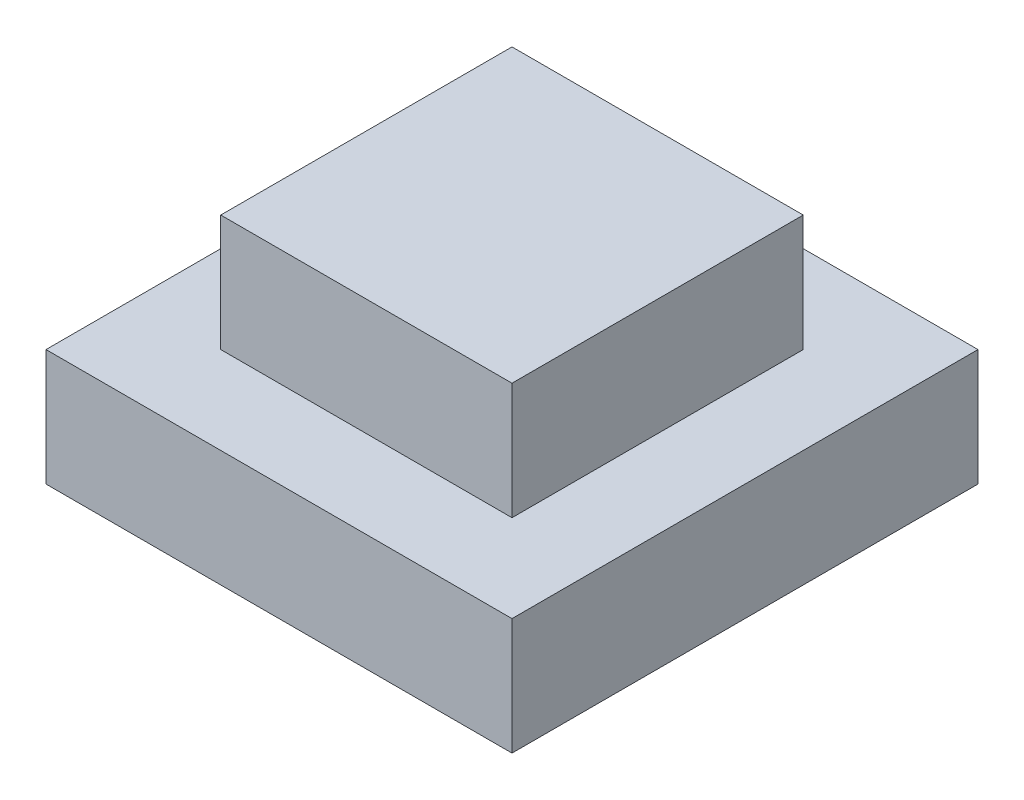
ISO-10303-21;
HEADER;
FILE_DESCRIPTION(('STEP AP214'),'2;1');
FILE_NAME('part.step','',(''),(''),'','','');
FILE_SCHEMA(('AUTOMOTIVE_DESIGN { 1 0 10303 214 1 1 1 1 }'));
ENDSEC;
DATA;
#1=APPLICATION_CONTEXT('core data for automotive mechanical design processes');
#2=APPLICATION_PROTOCOL_DEFINITION('international standard','automotive_design',2000,#1);
#3=PRODUCT_CONTEXT('',#1,'mechanical');
#4=PRODUCT('Part','Part','',(#3));
#5=PRODUCT_RELATED_PRODUCT_CATEGORY('part','',(#4));
#6=PRODUCT_DEFINITION_FORMATION('','',#4);
#7=PRODUCT_DEFINITION_CONTEXT('part definition',#1,'design');
#8=PRODUCT_DEFINITION('design','',#6,#7);
#9=PRODUCT_DEFINITION_SHAPE('','',#8);
#10=(LENGTH_UNIT() NAMED_UNIT(*) SI_UNIT(.MILLI.,.METRE.));
#11=(NAMED_UNIT(*) PLANE_ANGLE_UNIT() SI_UNIT($,.RADIAN.));
#12=(NAMED_UNIT(*) SI_UNIT($,.STERADIAN.) SOLID_ANGLE_UNIT());
#13=UNCERTAINTY_MEASURE_WITH_UNIT(LENGTH_MEASURE(1.E-05),#10,'distance_accuracy_value','');
#14=(GEOMETRIC_REPRESENTATION_CONTEXT(3) GLOBAL_UNCERTAINTY_ASSIGNED_CONTEXT((#13)) GLOBAL_UNIT_ASSIGNED_CONTEXT((#10,
#11,#12)) REPRESENTATION_CONTEXT('',''));
#15=CARTESIAN_POINT('',(0.,0.,0.));
#16=DIRECTION('',(0.,0.,1.));
#17=DIRECTION('',(1.,0.,0.));
#18=AXIS2_PLACEMENT_3D('',#15,#16,#17);
#19=CARTESIAN_POINT('',(4.,3.,-4.));
#20=DIRECTION('',(-1.,0.,0.));
#21=DIRECTION('',(0.,0.,1.));
#22=AXIS2_PLACEMENT_3D('',#19,#20,#21);
#23=PLANE('',#22);
#24=DIRECTION('',(0.,-1.,0.));
#25=VECTOR('',#24,1.);
#26=CARTESIAN_POINT('',(4.,3.,4.));
#27=LINE('',#26,#25);
#28=CARTESIAN_POINT('',(4.,3.,4.));
#29=VERTEX_POINT('',#28);
#30=CARTESIAN_POINT('',(4.,1.,4.));
#31=VERTEX_POINT('',#30);
#32=EDGE_CURVE('E155',#29,#31,#27,.T.);
#33=ORIENTED_EDGE('',*,*,#32,.T.);
#34=DIRECTION('',(0.,0.,-1.));
#35=VECTOR('',#34,1.);
#36=CARTESIAN_POINT('',(4.,1.,-4.));
#37=LINE('',#36,#35);
#38=CARTESIAN_POINT('',(4.,1.,-4.));
#39=VERTEX_POINT('',#38);
#40=EDGE_CURVE('E11',#31,#39,#37,.T.);
#41=ORIENTED_EDGE('',*,*,#40,.T.);
#42=DIRECTION('',(0.,-1.,0.));
#43=VECTOR('',#42,1.);
#44=CARTESIAN_POINT('',(4.,3.,-4.));
#45=LINE('',#44,#43);
#46=CARTESIAN_POINT('',(4.,3.,-4.));
#47=VERTEX_POINT('',#46);
#48=EDGE_CURVE('E164',#47,#39,#45,.T.);
#49=ORIENTED_EDGE('',*,*,#48,.F.);
#50=DIRECTION('',(0.,0.,-1.));
#51=VECTOR('',#50,1.);
#52=CARTESIAN_POINT('',(4.,3.,-4.));
#53=LINE('',#52,#51);
#54=EDGE_CURVE('E146',#29,#47,#53,.T.);
#55=ORIENTED_EDGE('',*,*,#54,.F.);
#56=EDGE_LOOP('',(#33,#41,#49,#55));
#57=FACE_BOUND('',#56,.T.);
#58=ADVANCED_FACE('F39',(#57),#23,.F.);
#59=CARTESIAN_POINT('',(-4.,3.,-4.));
#60=DIRECTION('',(0.,0.,1.));
#61=DIRECTION('',(1.,0.,0.));
#62=AXIS2_PLACEMENT_3D('',#59,#60,#61);
#63=PLANE('',#62);
#64=ORIENTED_EDGE('',*,*,#48,.T.);
#65=DIRECTION('',(-1.,0.,0.));
#66=VECTOR('',#65,1.);
#67=CARTESIAN_POINT('',(-4.,1.,-4.));
#68=LINE('',#67,#66);
#69=CARTESIAN_POINT('',(-4.,1.,-4.));
#70=VERTEX_POINT('',#69);
#71=EDGE_CURVE('E167',#39,#70,#68,.T.);
#72=ORIENTED_EDGE('',*,*,#71,.T.);
#73=DIRECTION('',(0.,-1.,0.));
#74=VECTOR('',#73,1.);
#75=CARTESIAN_POINT('',(-4.,3.,-4.));
#76=LINE('',#75,#74);
#77=CARTESIAN_POINT('',(-4.,3.,-4.));
#78=VERTEX_POINT('',#77);
#79=EDGE_CURVE('E161',#78,#70,#76,.T.);
#80=ORIENTED_EDGE('',*,*,#79,.F.);
#81=DIRECTION('',(-1.,0.,0.));
#82=VECTOR('',#81,1.);
#83=CARTESIAN_POINT('',(-4.,3.,-4.));
#84=LINE('',#83,#82);
#85=EDGE_CURVE('E149',#47,#78,#84,.T.);
#86=ORIENTED_EDGE('',*,*,#85,.F.);
#87=EDGE_LOOP('',(#64,#72,#80,#86));
#88=FACE_BOUND('',#87,.T.);
#89=ADVANCED_FACE('F210',(#88),#63,.F.);
#90=CARTESIAN_POINT('',(-4.,3.,-4.));
#91=DIRECTION('',(1.,0.,0.));
#92=DIRECTION('',(0.,0.,-1.));
#93=AXIS2_PLACEMENT_3D('',#90,#91,#92);
#94=PLANE('',#93);
#95=ORIENTED_EDGE('',*,*,#79,.T.);
#96=DIRECTION('',(0.,0.,1.));
#97=VECTOR('',#96,1.);
#98=CARTESIAN_POINT('',(-4.,1.,-4.));
#99=LINE('',#98,#97);
#100=CARTESIAN_POINT('',(-4.,1.,4.));
#101=VERTEX_POINT('',#100);
#102=EDGE_CURVE('E179',#70,#101,#99,.T.);
#103=ORIENTED_EDGE('',*,*,#102,.T.);
#104=DIRECTION('',(0.,-1.,0.));
#105=VECTOR('',#104,1.);
#106=CARTESIAN_POINT('',(-4.,3.,4.));
#107=LINE('',#106,#105);
#108=CARTESIAN_POINT('',(-4.,3.,4.));
#109=VERTEX_POINT('',#108);
#110=EDGE_CURVE('E158',#109,#101,#107,.T.);
#111=ORIENTED_EDGE('',*,*,#110,.F.);
#112=DIRECTION('',(0.,0.,1.));
#113=VECTOR('',#112,1.);
#114=CARTESIAN_POINT('',(-4.,3.,-4.));
#115=LINE('',#114,#113);
#116=EDGE_CURVE('E151',#78,#109,#115,.T.);
#117=ORIENTED_EDGE('',*,*,#116,.F.);
#118=EDGE_LOOP('',(#95,#103,#111,#117));
#119=FACE_BOUND('',#118,.T.);
#120=ADVANCED_FACE('F213',(#119),#94,.F.);
#121=CARTESIAN_POINT('',(-4.,3.,4.));
#122=DIRECTION('',(0.,0.,-1.));
#123=DIRECTION('',(-1.,0.,0.));
#124=AXIS2_PLACEMENT_3D('',#121,#122,#123);
#125=PLANE('',#124);
#126=ORIENTED_EDGE('',*,*,#110,.T.);
#127=DIRECTION('',(1.,0.,0.));
#128=VECTOR('',#127,1.);
#129=CARTESIAN_POINT('',(-4.,1.,4.));
#130=LINE('',#129,#128);
#131=EDGE_CURVE('E49',#101,#31,#130,.T.);
#132=ORIENTED_EDGE('',*,*,#131,.T.);
#133=ORIENTED_EDGE('',*,*,#32,.F.);
#134=DIRECTION('',(1.,0.,0.));
#135=VECTOR('',#134,1.);
#136=CARTESIAN_POINT('',(-4.,3.,4.));
#137=LINE('',#136,#135);
#138=EDGE_CURVE('E153',#109,#29,#137,.T.);
#139=ORIENTED_EDGE('',*,*,#138,.F.);
#140=EDGE_LOOP('',(#126,#132,#133,#139));
#141=FACE_BOUND('',#140,.T.);
#142=ADVANCED_FACE('F221',(#141),#125,.F.);
#143=CARTESIAN_POINT('',(0.,3.,0.));
#144=DIRECTION('',(0.,1.,0.));
#145=DIRECTION('',(0.,0.,1.));
#146=AXIS2_PLACEMENT_3D('',#143,#144,#145);
#147=PLANE('',#146);
#148=DIRECTION('',(0.,0.,-1.));
#149=VECTOR('',#148,1.);
#150=CARTESIAN_POINT('',(2.5,3.,-2.5));
#151=LINE('',#150,#149);
#152=CARTESIAN_POINT('',(2.5,3.,2.5));
#153=VERTEX_POINT('',#152);
#154=CARTESIAN_POINT('',(2.5,3.,-2.5));
#155=VERTEX_POINT('',#154);
#156=EDGE_CURVE('E57',#153,#155,#151,.T.);
#157=ORIENTED_EDGE('',*,*,#156,.F.);
#158=DIRECTION('',(1.,0.,0.));
#159=VECTOR('',#158,1.);
#160=CARTESIAN_POINT('',(-2.5,3.,2.5));
#161=LINE('',#160,#159);
#162=CARTESIAN_POINT('',(-2.5,3.,2.5));
#163=VERTEX_POINT('',#162);
#164=EDGE_CURVE('E61',#163,#153,#161,.T.);
#165=ORIENTED_EDGE('',*,*,#164,.F.);
#166=DIRECTION('',(0.,0.,1.));
#167=VECTOR('',#166,1.);
#168=CARTESIAN_POINT('',(-2.5,3.,-2.5));
#169=LINE('',#168,#167);
#170=CARTESIAN_POINT('',(-2.5,3.,-2.5));
#171=VERTEX_POINT('',#170);
#172=EDGE_CURVE('E386',#171,#163,#169,.T.);
#173=ORIENTED_EDGE('',*,*,#172,.F.);
#174=DIRECTION('',(-1.,0.,0.));
#175=VECTOR('',#174,1.);
#176=CARTESIAN_POINT('',(-2.5,3.,-2.5));
#177=LINE('',#176,#175);
#178=EDGE_CURVE('E392',#155,#171,#177,.T.);
#179=ORIENTED_EDGE('',*,*,#178,.F.);
#180=EDGE_LOOP('',(#157,#165,#173,#179));
#181=FACE_BOUND('',#180,.T.);
#182=ORIENTED_EDGE('',*,*,#54,.T.);
#183=ORIENTED_EDGE('',*,*,#85,.T.);
#184=ORIENTED_EDGE('',*,*,#116,.T.);
#185=ORIENTED_EDGE('',*,*,#138,.T.);
#186=EDGE_LOOP('',(#182,#183,#184,#185));
#187=FACE_BOUND('',#186,.T.);
#188=ADVANCED_FACE('F216',(#181,#187),#147,.T.);
#189=CARTESIAN_POINT('',(0.,0.,0.));
#190=DIRECTION('',(0.,1.,0.));
#191=DIRECTION('',(0.,0.,1.));
#192=AXIS2_PLACEMENT_3D('',#189,#190,#191);
#193=PLANE('',#192);
#194=DIRECTION('',(0.,0.,-1.));
#195=VECTOR('',#194,1.);
#196=CARTESIAN_POINT('',(-3.,0.,0.));
#197=LINE('',#196,#195);
#198=CARTESIAN_POINT('',(-3.,0.,3.));
#199=VERTEX_POINT('',#198);
#200=CARTESIAN_POINT('',(-3.,0.,-3.));
#201=VERTEX_POINT('',#200);
#202=EDGE_CURVE('E174',#199,#201,#197,.T.);
#203=ORIENTED_EDGE('',*,*,#202,.T.);
#204=DIRECTION('',(1.,0.,0.));
#205=VECTOR('',#204,1.);
#206=CARTESIAN_POINT('',(0.,0.,-3.));
#207=LINE('',#206,#205);
#208=CARTESIAN_POINT('',(3.,0.,-3.));
#209=VERTEX_POINT('',#208);
#210=EDGE_CURVE('E176',#201,#209,#207,.T.);
#211=ORIENTED_EDGE('',*,*,#210,.T.);
#212=DIRECTION('',(0.,0.,1.));
#213=VECTOR('',#212,1.);
#214=CARTESIAN_POINT('',(3.,0.,0.));
#215=LINE('',#214,#213);
#216=CARTESIAN_POINT('',(3.,0.,3.));
#217=VERTEX_POINT('',#216);
#218=EDGE_CURVE('E170',#209,#217,#215,.T.);
#219=ORIENTED_EDGE('',*,*,#218,.T.);
#220=DIRECTION('',(-1.,0.,0.));
#221=VECTOR('',#220,1.);
#222=CARTESIAN_POINT('',(0.,0.,3.));
#223=LINE('',#222,#221);
#224=EDGE_CURVE('E172',#217,#199,#223,.T.);
#225=ORIENTED_EDGE('',*,*,#224,.T.);
#226=EDGE_LOOP('',(#203,#211,#219,#225));
#227=FACE_BOUND('',#226,.T.);
#228=ADVANCED_FACE('F199',(#227),#193,.F.);
#229=CARTESIAN_POINT('',(-4.,1.,4.));
#230=DIRECTION('',(0.,0.707106781186548,-0.707106781186547));
#231=DIRECTION('',(1.,0.,0.));
#232=AXIS2_PLACEMENT_3D('',#229,#230,#231);
#233=PLANE('',#232);
#234=DIRECTION('',(0.577350269189626,-0.577350269189625,-0.577350269189626));
#235=VECTOR('',#234,1.);
#236=CARTESIAN_POINT('',(-4.,1.,4.));
#237=LINE('',#236,#235);
#238=EDGE_CURVE('E182',#199,#101,#237,.F.);
#239=ORIENTED_EDGE('',*,*,#238,.F.);
#240=ORIENTED_EDGE('',*,*,#224,.F.);
#241=DIRECTION('',(-0.577350269189626,-0.577350269189625,-0.577350269189626));
#242=VECTOR('',#241,1.);
#243=CARTESIAN_POINT('',(1.33333333333333,-1.66666666666666,1.33333333333333));
#244=LINE('',#243,#242);
#245=EDGE_CURVE('E44',#31,#217,#244,.T.);
#246=ORIENTED_EDGE('',*,*,#245,.F.);
#247=ORIENTED_EDGE('',*,*,#131,.F.);
#248=EDGE_LOOP('',(#239,#240,#246,#247));
#249=FACE_BOUND('',#248,.T.);
#250=ADVANCED_FACE('F42',(#249),#233,.F.);
#251=CARTESIAN_POINT('',(4.,1.,-4.));
#252=DIRECTION('',(-0.707106781186547,0.707106781186548,0.));
#253=DIRECTION('',(0.,0.,-1.));
#254=AXIS2_PLACEMENT_3D('',#251,#252,#253);
#255=PLANE('',#254);
#256=ORIENTED_EDGE('',*,*,#245,.T.);
#257=ORIENTED_EDGE('',*,*,#218,.F.);
#258=DIRECTION('',(0.577350269189626,0.577350269189625,-0.577350269189626));
#259=VECTOR('',#258,1.);
#260=CARTESIAN_POINT('',(4.,1.,-4.));
#261=LINE('',#260,#259);
#262=EDGE_CURVE('E140',#39,#209,#261,.F.);
#263=ORIENTED_EDGE('',*,*,#262,.F.);
#264=ORIENTED_EDGE('',*,*,#40,.F.);
#265=EDGE_LOOP('',(#256,#257,#263,#264));
#266=FACE_BOUND('',#265,.T.);
#267=ADVANCED_FACE('F193',(#266),#255,.F.);
#268=CARTESIAN_POINT('',(-4.,1.,-4.));
#269=DIRECTION('',(0.707106781186547,0.707106781186548,0.));
#270=DIRECTION('',(0.,0.,1.));
#271=AXIS2_PLACEMENT_3D('',#268,#269,#270);
#272=PLANE('',#271);
#273=ORIENTED_EDGE('',*,*,#238,.T.);
#274=ORIENTED_EDGE('',*,*,#102,.F.);
#275=DIRECTION('',(0.577350269189626,-0.577350269189625,0.577350269189626));
#276=VECTOR('',#275,1.);
#277=CARTESIAN_POINT('',(-4.,1.,-4.));
#278=LINE('',#277,#276);
#279=EDGE_CURVE('E138',#201,#70,#278,.F.);
#280=ORIENTED_EDGE('',*,*,#279,.F.);
#281=ORIENTED_EDGE('',*,*,#202,.F.);
#282=EDGE_LOOP('',(#273,#274,#280,#281));
#283=FACE_BOUND('',#282,.T.);
#284=ADVANCED_FACE('F205',(#283),#272,.F.);
#285=CARTESIAN_POINT('',(-4.,1.,-4.));
#286=DIRECTION('',(0.,0.707106781186548,0.707106781186547));
#287=DIRECTION('',(-1.,0.,0.));
#288=AXIS2_PLACEMENT_3D('',#285,#286,#287);
#289=PLANE('',#288);
#290=ORIENTED_EDGE('',*,*,#262,.T.);
#291=ORIENTED_EDGE('',*,*,#210,.F.);
#292=ORIENTED_EDGE('',*,*,#279,.T.);
#293=ORIENTED_EDGE('',*,*,#71,.F.);
#294=EDGE_LOOP('',(#290,#291,#292,#293));
#295=FACE_BOUND('',#294,.T.);
#296=ADVANCED_FACE('F203',(#295),#289,.F.);
#297=CARTESIAN_POINT('',(2.5,5.,-2.5));
#298=DIRECTION('',(-1.,0.,0.));
#299=DIRECTION('',(0.,0.,1.));
#300=AXIS2_PLACEMENT_3D('',#297,#298,#299);
#301=PLANE('',#300);
#302=ORIENTED_EDGE('',*,*,#156,.T.);
#303=DIRECTION('',(0.,-1.,0.));
#304=VECTOR('',#303,1.);
#305=CARTESIAN_POINT('',(2.5,5.,-2.5));
#306=LINE('',#305,#304);
#307=CARTESIAN_POINT('',(2.5,5.,-2.5));
#308=VERTEX_POINT('',#307);
#309=EDGE_CURVE('E121',#308,#155,#306,.T.);
#310=ORIENTED_EDGE('',*,*,#309,.F.);
#311=DIRECTION('',(0.,0.,-1.));
#312=VECTOR('',#311,1.);
#313=CARTESIAN_POINT('',(2.5,5.,-2.5));
#314=LINE('',#313,#312);
#315=CARTESIAN_POINT('',(2.5,5.,2.5));
#316=VERTEX_POINT('',#315);
#317=EDGE_CURVE('E127',#316,#308,#314,.T.);
#318=ORIENTED_EDGE('',*,*,#317,.F.);
#319=DIRECTION('',(0.,-1.,0.));
#320=VECTOR('',#319,1.);
#321=CARTESIAN_POINT('',(2.5,5.,2.5));
#322=LINE('',#321,#320);
#323=EDGE_CURVE('E384',#316,#153,#322,.T.);
#324=ORIENTED_EDGE('',*,*,#323,.T.);
#325=EDGE_LOOP('',(#302,#310,#318,#324));
#326=FACE_BOUND('',#325,.T.);
#327=ADVANCED_FACE('F137',(#326),#301,.F.);
#328=CARTESIAN_POINT('',(-2.5,5.,-2.5));
#329=DIRECTION('',(0.,0.,1.));
#330=DIRECTION('',(1.,0.,0.));
#331=AXIS2_PLACEMENT_3D('',#328,#329,#330);
#332=PLANE('',#331);
#333=ORIENTED_EDGE('',*,*,#178,.T.);
#334=DIRECTION('',(0.,-1.,0.));
#335=VECTOR('',#334,1.);
#336=CARTESIAN_POINT('',(-2.5,5.,-2.5));
#337=LINE('',#336,#335);
#338=CARTESIAN_POINT('',(-2.5,5.,-2.5));
#339=VERTEX_POINT('',#338);
#340=EDGE_CURVE('E123',#339,#171,#337,.T.);
#341=ORIENTED_EDGE('',*,*,#340,.F.);
#342=DIRECTION('',(-1.,0.,0.));
#343=VECTOR('',#342,1.);
#344=CARTESIAN_POINT('',(-2.5,5.,-2.5));
#345=LINE('',#344,#343);
#346=EDGE_CURVE('E116',#308,#339,#345,.T.);
#347=ORIENTED_EDGE('',*,*,#346,.F.);
#348=ORIENTED_EDGE('',*,*,#309,.T.);
#349=EDGE_LOOP('',(#333,#341,#347,#348));
#350=FACE_BOUND('',#349,.T.);
#351=ADVANCED_FACE('F119',(#350),#332,.F.);
#352=CARTESIAN_POINT('',(-2.5,5.,-2.5));
#353=DIRECTION('',(1.,0.,0.));
#354=DIRECTION('',(0.,0.,-1.));
#355=AXIS2_PLACEMENT_3D('',#352,#353,#354);
#356=PLANE('',#355);
#357=ORIENTED_EDGE('',*,*,#172,.T.);
#358=DIRECTION('',(0.,-1.,0.));
#359=VECTOR('',#358,1.);
#360=CARTESIAN_POINT('',(-2.5,5.,2.5));
#361=LINE('',#360,#359);
#362=CARTESIAN_POINT('',(-2.5,5.,2.5));
#363=VERTEX_POINT('',#362);
#364=EDGE_CURVE('E142',#363,#163,#361,.T.);
#365=ORIENTED_EDGE('',*,*,#364,.F.);
#366=DIRECTION('',(0.,0.,1.));
#367=VECTOR('',#366,1.);
#368=CARTESIAN_POINT('',(-2.5,5.,-2.5));
#369=LINE('',#368,#367);
#370=EDGE_CURVE('E126',#339,#363,#369,.T.);
#371=ORIENTED_EDGE('',*,*,#370,.F.);
#372=ORIENTED_EDGE('',*,*,#340,.T.);
#373=EDGE_LOOP('',(#357,#365,#371,#372));
#374=FACE_BOUND('',#373,.T.);
#375=ADVANCED_FACE('F265',(#374),#356,.F.);
#376=CARTESIAN_POINT('',(-2.5,5.,2.5));
#377=DIRECTION('',(0.,0.,-1.));
#378=DIRECTION('',(-1.,0.,0.));
#379=AXIS2_PLACEMENT_3D('',#376,#377,#378);
#380=PLANE('',#379);
#381=ORIENTED_EDGE('',*,*,#164,.T.);
#382=ORIENTED_EDGE('',*,*,#323,.F.);
#383=DIRECTION('',(1.,0.,0.));
#384=VECTOR('',#383,1.);
#385=CARTESIAN_POINT('',(-2.5,5.,2.5));
#386=LINE('',#385,#384);
#387=EDGE_CURVE('E132',#363,#316,#386,.T.);
#388=ORIENTED_EDGE('',*,*,#387,.F.);
#389=ORIENTED_EDGE('',*,*,#364,.T.);
#390=EDGE_LOOP('',(#381,#382,#388,#389));
#391=FACE_BOUND('',#390,.T.);
#392=ADVANCED_FACE('F268',(#391),#380,.F.);
#393=CARTESIAN_POINT('',(0.,5.,0.));
#394=DIRECTION('',(0.,1.,0.));
#395=DIRECTION('',(0.,0.,1.));
#396=AXIS2_PLACEMENT_3D('',#393,#394,#395);
#397=PLANE('',#396);
#398=ORIENTED_EDGE('',*,*,#317,.T.);
#399=ORIENTED_EDGE('',*,*,#346,.T.);
#400=ORIENTED_EDGE('',*,*,#370,.T.);
#401=ORIENTED_EDGE('',*,*,#387,.T.);
#402=EDGE_LOOP('',(#398,#399,#400,#401));
#403=FACE_BOUND('',#402,.T.);
#404=ADVANCED_FACE('F130',(#403),#397,.T.);
#405=CLOSED_SHELL('',(#58,#89,#120,#142,#188,#228,#250,#267,#284,#296,#327,#351,#375,#392,#404));
#406=MANIFOLD_SOLID_BREP('B2',#405);
#407=ADVANCED_BREP_SHAPE_REPRESENTATION('',(#18,#406),#14);
#408=SHAPE_DEFINITION_REPRESENTATION(#9,#407);
ENDSEC;
END-ISO-10303-21;
